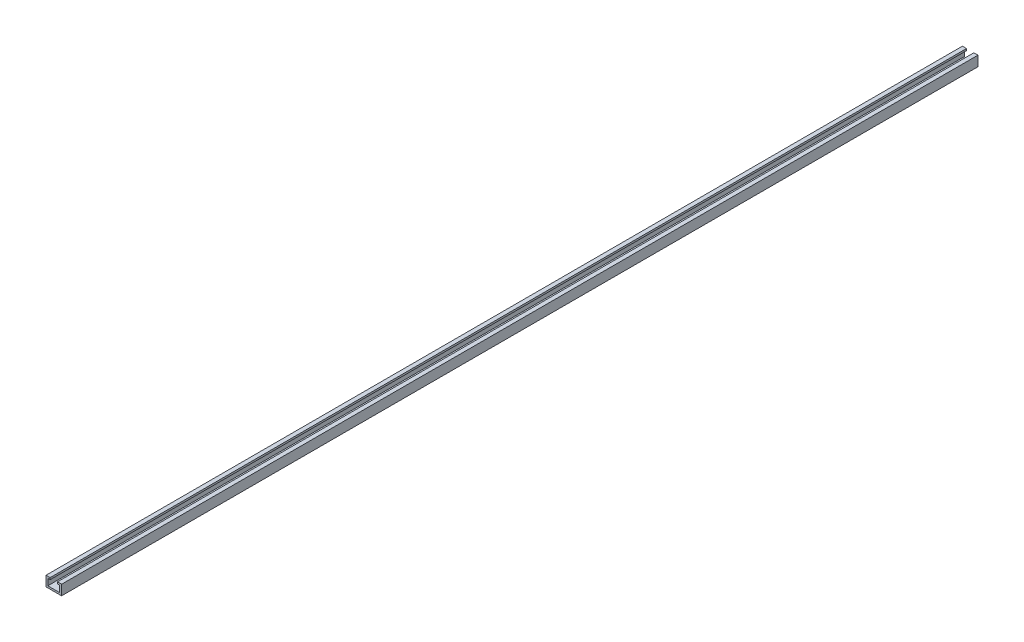
ISO-10303-21;
HEADER;
FILE_DESCRIPTION(('STEP AP214'),'2;1');
FILE_NAME('part.step','',(''),(''),'','','');
FILE_SCHEMA(('AUTOMOTIVE_DESIGN { 1 0 10303 214 1 1 1 1 }'));
ENDSEC;
DATA;
#1=APPLICATION_CONTEXT('core data for automotive mechanical design processes');
#2=APPLICATION_PROTOCOL_DEFINITION('international standard','automotive_design',2000,#1);
#3=PRODUCT_CONTEXT('',#1,'mechanical');
#4=PRODUCT('Part','Part','',(#3));
#5=PRODUCT_RELATED_PRODUCT_CATEGORY('part','',(#4));
#6=PRODUCT_DEFINITION_FORMATION('','',#4);
#7=PRODUCT_DEFINITION_CONTEXT('part definition',#1,'design');
#8=PRODUCT_DEFINITION('design','',#6,#7);
#9=PRODUCT_DEFINITION_SHAPE('','',#8);
#10=(LENGTH_UNIT() NAMED_UNIT(*) SI_UNIT(.MILLI.,.METRE.));
#11=(NAMED_UNIT(*) PLANE_ANGLE_UNIT() SI_UNIT($,.RADIAN.));
#12=(NAMED_UNIT(*) SI_UNIT($,.STERADIAN.) SOLID_ANGLE_UNIT());
#13=UNCERTAINTY_MEASURE_WITH_UNIT(LENGTH_MEASURE(1.E-05),#10,'distance_accuracy_value','');
#14=(GEOMETRIC_REPRESENTATION_CONTEXT(3) GLOBAL_UNCERTAINTY_ASSIGNED_CONTEXT((#13)) GLOBAL_UNIT_ASSIGNED_CONTEXT((#10,
#11,#12)) REPRESENTATION_CONTEXT('',''));
#15=CARTESIAN_POINT('',(0.,0.,0.));
#16=DIRECTION('',(0.,0.,1.));
#17=DIRECTION('',(1.,0.,0.));
#18=AXIS2_PLACEMENT_3D('',#15,#16,#17);
#19=CARTESIAN_POINT('',(-6.5,9.,1000.));
#20=DIRECTION('',(-1.,0.,0.));
#21=DIRECTION('',(0.,-1.,0.));
#22=AXIS2_PLACEMENT_3D('',#19,#20,#21);
#23=PLANE('',#22);
#24=DIRECTION('',(0.,1.,0.));
#25=VECTOR('',#24,1.);
#26=CARTESIAN_POINT('',(-6.5,9.,0.));
#27=LINE('',#26,#25);
#28=CARTESIAN_POINT('',(-6.5,2.,0.));
#29=VERTEX_POINT('',#28);
#30=CARTESIAN_POINT('',(-6.5,9.,0.));
#31=VERTEX_POINT('',#30);
#32=EDGE_CURVE('E153',#29,#31,#27,.T.);
#33=ORIENTED_EDGE('',*,*,#32,.T.);
#34=DIRECTION('',(0.,0.,-1.));
#35=VECTOR('',#34,1.);
#36=CARTESIAN_POINT('',(-6.5,9.,1000.));
#37=LINE('',#36,#35);
#38=CARTESIAN_POINT('',(-6.5,9.,1000.));
#39=VERTEX_POINT('',#38);
#40=EDGE_CURVE('E11',#39,#31,#37,.T.);
#41=ORIENTED_EDGE('',*,*,#40,.F.);
#42=DIRECTION('',(0.,1.,0.));
#43=VECTOR('',#42,1.);
#44=CARTESIAN_POINT('',(-6.5,9.,1000.));
#45=LINE('',#44,#43);
#46=CARTESIAN_POINT('',(-6.5,2.,1000.));
#47=VERTEX_POINT('',#46);
#48=EDGE_CURVE('E175',#47,#39,#45,.T.);
#49=ORIENTED_EDGE('',*,*,#48,.F.);
#50=DIRECTION('',(0.,0.,-1.));
#51=VECTOR('',#50,1.);
#52=CARTESIAN_POINT('',(-6.5,2.,1000.));
#53=LINE('',#52,#51);
#54=EDGE_CURVE('E149',#47,#29,#53,.T.);
#55=ORIENTED_EDGE('',*,*,#54,.T.);
#56=EDGE_LOOP('',(#33,#41,#49,#55));
#57=FACE_BOUND('',#56,.T.);
#58=ADVANCED_FACE('F33',(#57),#23,.F.);
#59=CARTESIAN_POINT('',(-4.,8.99999999999999,1000.));
#60=DIRECTION('',(0.,1.,0.));
#61=DIRECTION('',(-1.,0.,0.));
#62=AXIS2_PLACEMENT_3D('',#59,#60,#61);
#63=PLANE('',#62);
#64=DIRECTION('',(1.,0.,0.));
#65=VECTOR('',#64,1.);
#66=CARTESIAN_POINT('',(-4.,8.99999999999999,0.));
#67=LINE('',#66,#65);
#68=CARTESIAN_POINT('',(-4.,8.99999999999999,0.));
#69=VERTEX_POINT('',#68);
#70=EDGE_CURVE('E156',#31,#69,#67,.T.);
#71=ORIENTED_EDGE('',*,*,#70,.T.);
#72=DIRECTION('',(0.,0.,-1.));
#73=VECTOR('',#72,1.);
#74=CARTESIAN_POINT('',(-4.,8.99999999999999,1000.));
#75=LINE('',#74,#73);
#76=CARTESIAN_POINT('',(-4.,8.99999999999999,1000.));
#77=VERTEX_POINT('',#76);
#78=EDGE_CURVE('E41',#77,#69,#75,.T.);
#79=ORIENTED_EDGE('',*,*,#78,.F.);
#80=DIRECTION('',(1.,0.,0.));
#81=VECTOR('',#80,1.);
#82=CARTESIAN_POINT('',(-4.,8.99999999999999,1000.));
#83=LINE('',#82,#81);
#84=EDGE_CURVE('E104',#39,#77,#83,.T.);
#85=ORIENTED_EDGE('',*,*,#84,.F.);
#86=ORIENTED_EDGE('',*,*,#40,.T.);
#87=EDGE_LOOP('',(#71,#79,#85,#86));
#88=FACE_BOUND('',#87,.T.);
#89=ADVANCED_FACE('F253',(#88),#63,.F.);
#90=CARTESIAN_POINT('',(-4.,11.,1000.));
#91=DIRECTION('',(-1.,0.,0.));
#92=DIRECTION('',(0.,0.,1.));
#93=AXIS2_PLACEMENT_3D('',#90,#91,#92);
#94=PLANE('',#93);
#95=DIRECTION('',(0.,1.,0.));
#96=VECTOR('',#95,1.);
#97=CARTESIAN_POINT('',(-4.,11.,0.));
#98=LINE('',#97,#96);
#99=CARTESIAN_POINT('',(-4.,11.,0.));
#100=VERTEX_POINT('',#99);
#101=EDGE_CURVE('E158',#69,#100,#98,.T.);
#102=ORIENTED_EDGE('',*,*,#101,.T.);
#103=DIRECTION('',(0.,0.,-1.));
#104=VECTOR('',#103,1.);
#105=CARTESIAN_POINT('',(-4.,11.,1000.));
#106=LINE('',#105,#104);
#107=CARTESIAN_POINT('',(-4.,11.,1000.));
#108=VERTEX_POINT('',#107);
#109=EDGE_CURVE('E194',#108,#100,#106,.T.);
#110=ORIENTED_EDGE('',*,*,#109,.F.);
#111=DIRECTION('',(0.,1.,0.));
#112=VECTOR('',#111,1.);
#113=CARTESIAN_POINT('',(-4.,11.,1000.));
#114=LINE('',#113,#112);
#115=EDGE_CURVE('E202',#77,#108,#114,.T.);
#116=ORIENTED_EDGE('',*,*,#115,.F.);
#117=ORIENTED_EDGE('',*,*,#78,.T.);
#118=EDGE_LOOP('',(#102,#110,#116,#117));
#119=FACE_BOUND('',#118,.T.);
#120=ADVANCED_FACE('F200',(#119),#94,.F.);
#121=CARTESIAN_POINT('',(-8.5,11.,1000.));
#122=DIRECTION('',(0.,-1.,0.));
#123=DIRECTION('',(0.,0.,-1.));
#124=AXIS2_PLACEMENT_3D('',#121,#122,#123);
#125=PLANE('',#124);
#126=DIRECTION('',(-1.,0.,0.));
#127=VECTOR('',#126,1.);
#128=CARTESIAN_POINT('',(-8.5,11.,0.));
#129=LINE('',#128,#127);
#130=CARTESIAN_POINT('',(-8.5,11.,0.));
#131=VERTEX_POINT('',#130);
#132=EDGE_CURVE('E160',#100,#131,#129,.T.);
#133=ORIENTED_EDGE('',*,*,#132,.T.);
#134=DIRECTION('',(0.,0.,-1.));
#135=VECTOR('',#134,1.);
#136=CARTESIAN_POINT('',(-8.5,11.,1000.));
#137=LINE('',#136,#135);
#138=CARTESIAN_POINT('',(-8.5,11.,1000.));
#139=VERTEX_POINT('',#138);
#140=EDGE_CURVE('E191',#139,#131,#137,.T.);
#141=ORIENTED_EDGE('',*,*,#140,.F.);
#142=DIRECTION('',(-1.,0.,0.));
#143=VECTOR('',#142,1.);
#144=CARTESIAN_POINT('',(-8.5,11.,1000.));
#145=LINE('',#144,#143);
#146=EDGE_CURVE('E220',#108,#139,#145,.T.);
#147=ORIENTED_EDGE('',*,*,#146,.F.);
#148=ORIENTED_EDGE('',*,*,#109,.T.);
#149=EDGE_LOOP('',(#133,#141,#147,#148));
#150=FACE_BOUND('',#149,.T.);
#151=ADVANCED_FACE('F211',(#150),#125,.F.);
#152=CARTESIAN_POINT('',(-8.5,0.,1000.));
#153=DIRECTION('',(1.,0.,0.));
#154=DIRECTION('',(0.,0.,-1.));
#155=AXIS2_PLACEMENT_3D('',#152,#153,#154);
#156=PLANE('',#155);
#157=DIRECTION('',(0.,-1.,0.));
#158=VECTOR('',#157,1.);
#159=CARTESIAN_POINT('',(-8.5,0.,0.));
#160=LINE('',#159,#158);
#161=CARTESIAN_POINT('',(-8.5,0.,0.));
#162=VERTEX_POINT('',#161);
#163=EDGE_CURVE('E162',#131,#162,#160,.T.);
#164=ORIENTED_EDGE('',*,*,#163,.T.);
#165=DIRECTION('',(0.,0.,-1.));
#166=VECTOR('',#165,1.);
#167=CARTESIAN_POINT('',(-8.5,0.,1000.));
#168=LINE('',#167,#166);
#169=CARTESIAN_POINT('',(-8.5,0.,1000.));
#170=VERTEX_POINT('',#169);
#171=EDGE_CURVE('E188',#170,#162,#168,.T.);
#172=ORIENTED_EDGE('',*,*,#171,.F.);
#173=DIRECTION('',(0.,-1.,0.));
#174=VECTOR('',#173,1.);
#175=CARTESIAN_POINT('',(-8.5,0.,1000.));
#176=LINE('',#175,#174);
#177=EDGE_CURVE('E217',#139,#170,#176,.T.);
#178=ORIENTED_EDGE('',*,*,#177,.F.);
#179=ORIENTED_EDGE('',*,*,#140,.T.);
#180=EDGE_LOOP('',(#164,#172,#178,#179));
#181=FACE_BOUND('',#180,.T.);
#182=ADVANCED_FACE('F215',(#181),#156,.F.);
#183=CARTESIAN_POINT('',(-8.5,0.,1000.));
#184=DIRECTION('',(0.,1.,0.));
#185=DIRECTION('',(0.,0.,1.));
#186=AXIS2_PLACEMENT_3D('',#183,#184,#185);
#187=PLANE('',#186);
#188=DIRECTION('',(1.,0.,0.));
#189=VECTOR('',#188,1.);
#190=CARTESIAN_POINT('',(-8.5,0.,0.));
#191=LINE('',#190,#189);
#192=CARTESIAN_POINT('',(8.5,0.,0.));
#193=VERTEX_POINT('',#192);
#194=EDGE_CURVE('E164',#162,#193,#191,.T.);
#195=ORIENTED_EDGE('',*,*,#194,.T.);
#196=DIRECTION('',(0.,0.,-1.));
#197=VECTOR('',#196,1.);
#198=CARTESIAN_POINT('',(8.5,0.,1000.));
#199=LINE('',#198,#197);
#200=CARTESIAN_POINT('',(8.5,0.,1000.));
#201=VERTEX_POINT('',#200);
#202=EDGE_CURVE('E185',#201,#193,#199,.T.);
#203=ORIENTED_EDGE('',*,*,#202,.F.);
#204=DIRECTION('',(1.,0.,0.));
#205=VECTOR('',#204,1.);
#206=CARTESIAN_POINT('',(-8.5,0.,1000.));
#207=LINE('',#206,#205);
#208=EDGE_CURVE('E219',#170,#201,#207,.T.);
#209=ORIENTED_EDGE('',*,*,#208,.F.);
#210=ORIENTED_EDGE('',*,*,#171,.T.);
#211=EDGE_LOOP('',(#195,#203,#209,#210));
#212=FACE_BOUND('',#211,.T.);
#213=ADVANCED_FACE('F266',(#212),#187,.F.);
#214=CARTESIAN_POINT('',(8.5,0.,1000.));
#215=DIRECTION('',(-1.,0.,0.));
#216=DIRECTION('',(0.,0.,1.));
#217=AXIS2_PLACEMENT_3D('',#214,#215,#216);
#218=PLANE('',#217);
#219=DIRECTION('',(0.,1.,0.));
#220=VECTOR('',#219,1.);
#221=CARTESIAN_POINT('',(8.5,0.,0.));
#222=LINE('',#221,#220);
#223=CARTESIAN_POINT('',(8.5,11.,0.));
#224=VERTEX_POINT('',#223);
#225=EDGE_CURVE('E166',#193,#224,#222,.T.);
#226=ORIENTED_EDGE('',*,*,#225,.T.);
#227=DIRECTION('',(0.,0.,-1.));
#228=VECTOR('',#227,1.);
#229=CARTESIAN_POINT('',(8.5,11.,1000.));
#230=LINE('',#229,#228);
#231=CARTESIAN_POINT('',(8.5,11.,1000.));
#232=VERTEX_POINT('',#231);
#233=EDGE_CURVE('E182',#232,#224,#230,.T.);
#234=ORIENTED_EDGE('',*,*,#233,.F.);
#235=DIRECTION('',(0.,1.,0.));
#236=VECTOR('',#235,1.);
#237=CARTESIAN_POINT('',(8.5,0.,1000.));
#238=LINE('',#237,#236);
#239=EDGE_CURVE('E222',#201,#232,#238,.T.);
#240=ORIENTED_EDGE('',*,*,#239,.F.);
#241=ORIENTED_EDGE('',*,*,#202,.T.);
#242=EDGE_LOOP('',(#226,#234,#240,#241));
#243=FACE_BOUND('',#242,.T.);
#244=ADVANCED_FACE('F269',(#243),#218,.F.);
#245=CARTESIAN_POINT('',(8.5,11.,1000.));
#246=DIRECTION('',(0.,-1.,0.));
#247=DIRECTION('',(0.,0.,-1.));
#248=AXIS2_PLACEMENT_3D('',#245,#246,#247);
#249=PLANE('',#248);
#250=DIRECTION('',(-1.,0.,0.));
#251=VECTOR('',#250,1.);
#252=CARTESIAN_POINT('',(8.5,11.,0.));
#253=LINE('',#252,#251);
#254=CARTESIAN_POINT('',(4.,11.,0.));
#255=VERTEX_POINT('',#254);
#256=EDGE_CURVE('E168',#224,#255,#253,.T.);
#257=ORIENTED_EDGE('',*,*,#256,.T.);
#258=DIRECTION('',(0.,0.,-1.));
#259=VECTOR('',#258,1.);
#260=CARTESIAN_POINT('',(4.,11.,1000.));
#261=LINE('',#260,#259);
#262=CARTESIAN_POINT('',(4.,11.,1000.));
#263=VERTEX_POINT('',#262);
#264=EDGE_CURVE('E179',#263,#255,#261,.T.);
#265=ORIENTED_EDGE('',*,*,#264,.F.);
#266=DIRECTION('',(-1.,0.,0.));
#267=VECTOR('',#266,1.);
#268=CARTESIAN_POINT('',(8.5,11.,1000.));
#269=LINE('',#268,#267);
#270=EDGE_CURVE('E228',#232,#263,#269,.T.);
#271=ORIENTED_EDGE('',*,*,#270,.F.);
#272=ORIENTED_EDGE('',*,*,#233,.T.);
#273=EDGE_LOOP('',(#257,#265,#271,#272));
#274=FACE_BOUND('',#273,.T.);
#275=ADVANCED_FACE('F234',(#274),#249,.F.);
#276=CARTESIAN_POINT('',(4.,11.,1000.));
#277=DIRECTION('',(1.,0.,0.));
#278=DIRECTION('',(0.,0.,-1.));
#279=AXIS2_PLACEMENT_3D('',#276,#277,#278);
#280=PLANE('',#279);
#281=DIRECTION('',(0.,-1.,0.));
#282=VECTOR('',#281,1.);
#283=CARTESIAN_POINT('',(4.,11.,0.));
#284=LINE('',#283,#282);
#285=CARTESIAN_POINT('',(4.,8.99999999999999,0.));
#286=VERTEX_POINT('',#285);
#287=EDGE_CURVE('E170',#255,#286,#284,.T.);
#288=ORIENTED_EDGE('',*,*,#287,.T.);
#289=DIRECTION('',(0.,0.,-1.));
#290=VECTOR('',#289,1.);
#291=CARTESIAN_POINT('',(4.,8.99999999999999,1000.));
#292=LINE('',#291,#290);
#293=CARTESIAN_POINT('',(4.,8.99999999999999,1000.));
#294=VERTEX_POINT('',#293);
#295=EDGE_CURVE('E144',#294,#286,#292,.T.);
#296=ORIENTED_EDGE('',*,*,#295,.F.);
#297=DIRECTION('',(0.,-1.,0.));
#298=VECTOR('',#297,1.);
#299=CARTESIAN_POINT('',(4.,11.,1000.));
#300=LINE('',#299,#298);
#301=EDGE_CURVE('E135',#263,#294,#300,.T.);
#302=ORIENTED_EDGE('',*,*,#301,.F.);
#303=ORIENTED_EDGE('',*,*,#264,.T.);
#304=EDGE_LOOP('',(#288,#296,#302,#303));
#305=FACE_BOUND('',#304,.T.);
#306=ADVANCED_FACE('F238',(#305),#280,.F.);
#307=CARTESIAN_POINT('',(4.,8.99999999999999,1000.));
#308=DIRECTION('',(0.,1.,0.));
#309=DIRECTION('',(-1.,0.,0.));
#310=AXIS2_PLACEMENT_3D('',#307,#308,#309);
#311=PLANE('',#310);
#312=DIRECTION('',(1.,0.,0.));
#313=VECTOR('',#312,1.);
#314=CARTESIAN_POINT('',(4.,8.99999999999999,0.));
#315=LINE('',#314,#313);
#316=CARTESIAN_POINT('',(6.5,9.,0.));
#317=VERTEX_POINT('',#316);
#318=EDGE_CURVE('E143',#286,#317,#315,.T.);
#319=ORIENTED_EDGE('',*,*,#318,.T.);
#320=DIRECTION('',(0.,0.,-1.));
#321=VECTOR('',#320,1.);
#322=CARTESIAN_POINT('',(6.5,9.,1000.));
#323=LINE('',#322,#321);
#324=CARTESIAN_POINT('',(6.5,9.,1000.));
#325=VERTEX_POINT('',#324);
#326=EDGE_CURVE('E140',#325,#317,#323,.T.);
#327=ORIENTED_EDGE('',*,*,#326,.F.);
#328=DIRECTION('',(1.,0.,0.));
#329=VECTOR('',#328,1.);
#330=CARTESIAN_POINT('',(4.,8.99999999999999,1000.));
#331=LINE('',#330,#329);
#332=EDGE_CURVE('E129',#294,#325,#331,.T.);
#333=ORIENTED_EDGE('',*,*,#332,.F.);
#334=ORIENTED_EDGE('',*,*,#295,.T.);
#335=EDGE_LOOP('',(#319,#327,#333,#334));
#336=FACE_BOUND('',#335,.T.);
#337=ADVANCED_FACE('F141',(#336),#311,.F.);
#338=CARTESIAN_POINT('',(6.5,9.,1000.));
#339=DIRECTION('',(1.,0.,0.));
#340=DIRECTION('',(0.,1.,0.));
#341=AXIS2_PLACEMENT_3D('',#338,#339,#340);
#342=PLANE('',#341);
#343=DIRECTION('',(0.,-1.,0.));
#344=VECTOR('',#343,1.);
#345=CARTESIAN_POINT('',(6.5,9.,0.));
#346=LINE('',#345,#344);
#347=CARTESIAN_POINT('',(6.5,2.,0.));
#348=VERTEX_POINT('',#347);
#349=EDGE_CURVE('E90',#317,#348,#346,.T.);
#350=ORIENTED_EDGE('',*,*,#349,.T.);
#351=DIRECTION('',(0.,0.,-1.));
#352=VECTOR('',#351,1.);
#353=CARTESIAN_POINT('',(6.5,2.,1000.));
#354=LINE('',#353,#352);
#355=CARTESIAN_POINT('',(6.5,2.,1000.));
#356=VERTEX_POINT('',#355);
#357=EDGE_CURVE('E145',#356,#348,#354,.T.);
#358=ORIENTED_EDGE('',*,*,#357,.F.);
#359=DIRECTION('',(0.,-1.,0.));
#360=VECTOR('',#359,1.);
#361=CARTESIAN_POINT('',(6.5,9.,1000.));
#362=LINE('',#361,#360);
#363=EDGE_CURVE('E133',#325,#356,#362,.T.);
#364=ORIENTED_EDGE('',*,*,#363,.F.);
#365=ORIENTED_EDGE('',*,*,#326,.T.);
#366=EDGE_LOOP('',(#350,#358,#364,#365));
#367=FACE_BOUND('',#366,.T.);
#368=ADVANCED_FACE('F147',(#367),#342,.F.);
#369=CARTESIAN_POINT('',(6.5,2.,1000.));
#370=DIRECTION('',(0.,-1.,0.));
#371=DIRECTION('',(0.,0.,-1.));
#372=AXIS2_PLACEMENT_3D('',#369,#370,#371);
#373=PLANE('',#372);
#374=DIRECTION('',(-1.,0.,0.));
#375=VECTOR('',#374,1.);
#376=CARTESIAN_POINT('',(6.5,2.,0.));
#377=LINE('',#376,#375);
#378=EDGE_CURVE('E96',#348,#29,#377,.T.);
#379=ORIENTED_EDGE('',*,*,#378,.T.);
#380=ORIENTED_EDGE('',*,*,#54,.F.);
#381=DIRECTION('',(-1.,0.,0.));
#382=VECTOR('',#381,1.);
#383=CARTESIAN_POINT('',(6.5,2.,1000.));
#384=LINE('',#383,#382);
#385=EDGE_CURVE('E49',#356,#47,#384,.T.);
#386=ORIENTED_EDGE('',*,*,#385,.F.);
#387=ORIENTED_EDGE('',*,*,#357,.T.);
#388=EDGE_LOOP('',(#379,#380,#386,#387));
#389=FACE_BOUND('',#388,.T.);
#390=ADVANCED_FACE('F242',(#389),#373,.F.);
#391=CARTESIAN_POINT('',(0.,0.,1000.));
#392=DIRECTION('',(0.,0.,-1.));
#393=DIRECTION('',(-1.,0.,0.));
#394=AXIS2_PLACEMENT_3D('',#391,#392,#393);
#395=PLANE('',#394);
#396=ORIENTED_EDGE('',*,*,#48,.T.);
#397=ORIENTED_EDGE('',*,*,#84,.T.);
#398=ORIENTED_EDGE('',*,*,#115,.T.);
#399=ORIENTED_EDGE('',*,*,#146,.T.);
#400=ORIENTED_EDGE('',*,*,#177,.T.);
#401=ORIENTED_EDGE('',*,*,#208,.T.);
#402=ORIENTED_EDGE('',*,*,#239,.T.);
#403=ORIENTED_EDGE('',*,*,#270,.T.);
#404=ORIENTED_EDGE('',*,*,#301,.T.);
#405=ORIENTED_EDGE('',*,*,#332,.T.);
#406=ORIENTED_EDGE('',*,*,#363,.T.);
#407=ORIENTED_EDGE('',*,*,#385,.T.);
#408=EDGE_LOOP('',(#396,#397,#398,#399,#400,#401,#402,#403,#404,#405,#406,#407));
#409=FACE_BOUND('',#408,.T.);
#410=ADVANCED_FACE('F131',(#409),#395,.F.);
#411=CARTESIAN_POINT('',(0.,0.,0.));
#412=DIRECTION('',(0.,0.,-1.));
#413=DIRECTION('',(-1.,0.,0.));
#414=AXIS2_PLACEMENT_3D('',#411,#412,#413);
#415=PLANE('',#414);
#416=ORIENTED_EDGE('',*,*,#32,.F.);
#417=ORIENTED_EDGE('',*,*,#378,.F.);
#418=ORIENTED_EDGE('',*,*,#349,.F.);
#419=ORIENTED_EDGE('',*,*,#318,.F.);
#420=ORIENTED_EDGE('',*,*,#287,.F.);
#421=ORIENTED_EDGE('',*,*,#256,.F.);
#422=ORIENTED_EDGE('',*,*,#225,.F.);
#423=ORIENTED_EDGE('',*,*,#194,.F.);
#424=ORIENTED_EDGE('',*,*,#163,.F.);
#425=ORIENTED_EDGE('',*,*,#132,.F.);
#426=ORIENTED_EDGE('',*,*,#101,.F.);
#427=ORIENTED_EDGE('',*,*,#70,.F.);
#428=EDGE_LOOP('',(#416,#417,#418,#419,#420,#421,#422,#423,#424,#425,#426,#427));
#429=FACE_BOUND('',#428,.T.);
#430=ADVANCED_FACE('F206',(#429),#415,.T.);
#431=CLOSED_SHELL('',(#58,#89,#120,#151,#182,#213,#244,#275,#306,#337,#368,#390,#410,#430));
#432=MANIFOLD_SOLID_BREP('B2',#431);
#433=ADVANCED_BREP_SHAPE_REPRESENTATION('',(#18,#432),#14);
#434=SHAPE_DEFINITION_REPRESENTATION(#9,#433);
ENDSEC;
END-ISO-10303-21;
